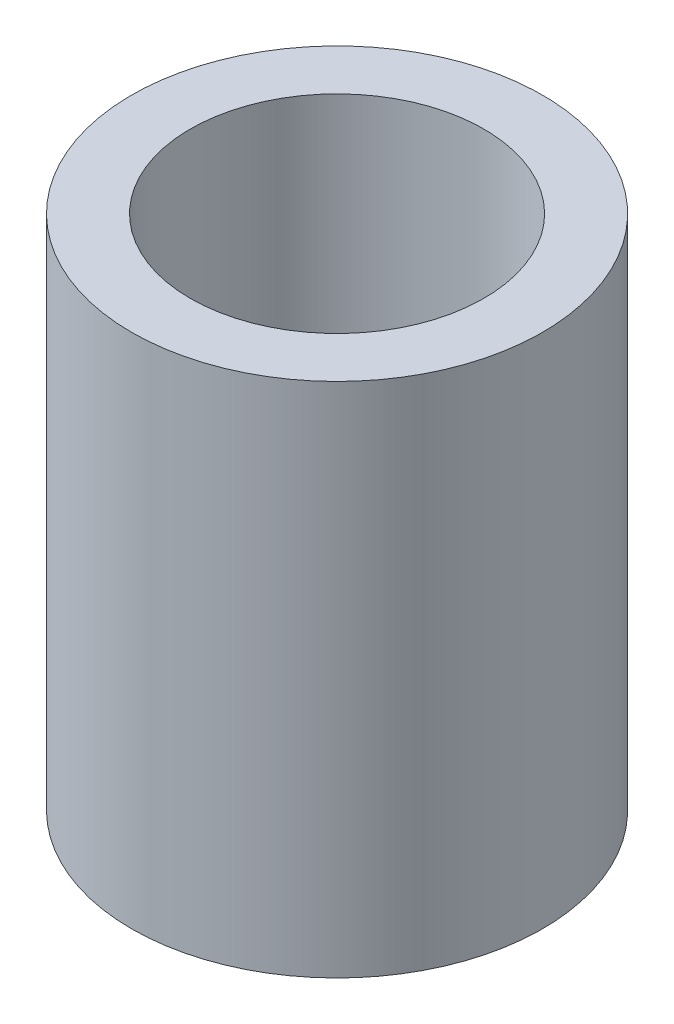
ISO-10303-21;
HEADER;
FILE_DESCRIPTION(('STEP AP214'),'2;1');
FILE_NAME('part.step','',(''),(''),'','','');
FILE_SCHEMA(('AUTOMOTIVE_DESIGN { 1 0 10303 214 1 1 1 1 }'));
ENDSEC;
DATA;
#1=APPLICATION_CONTEXT('core data for automotive mechanical design processes');
#2=APPLICATION_PROTOCOL_DEFINITION('international standard','automotive_design',2000,#1);
#3=PRODUCT_CONTEXT('',#1,'mechanical');
#4=PRODUCT('Part','Part','',(#3));
#5=PRODUCT_RELATED_PRODUCT_CATEGORY('part','',(#4));
#6=PRODUCT_DEFINITION_FORMATION('','',#4);
#7=PRODUCT_DEFINITION_CONTEXT('part definition',#1,'design');
#8=PRODUCT_DEFINITION('design','',#6,#7);
#9=PRODUCT_DEFINITION_SHAPE('','',#8);
#10=(LENGTH_UNIT() NAMED_UNIT(*) SI_UNIT(.MILLI.,.METRE.));
#11=(NAMED_UNIT(*) PLANE_ANGLE_UNIT() SI_UNIT($,.RADIAN.));
#12=(NAMED_UNIT(*) SI_UNIT($,.STERADIAN.) SOLID_ANGLE_UNIT());
#13=UNCERTAINTY_MEASURE_WITH_UNIT(LENGTH_MEASURE(1.E-05),#10,'distance_accuracy_value','');
#14=(GEOMETRIC_REPRESENTATION_CONTEXT(3) GLOBAL_UNCERTAINTY_ASSIGNED_CONTEXT((#13)) GLOBAL_UNIT_ASSIGNED_CONTEXT((#10,
#11,#12)) REPRESENTATION_CONTEXT('',''));
#15=CARTESIAN_POINT('',(0.,0.,0.));
#16=DIRECTION('',(0.,0.,1.));
#17=DIRECTION('',(1.,0.,0.));
#18=AXIS2_PLACEMENT_3D('',#15,#16,#17);
#19=CARTESIAN_POINT('',(0.,-13.97,0.));
#20=DIRECTION('',(0.,1.,0.));
#21=DIRECTION('',(0.,0.,1.));
#22=AXIS2_PLACEMENT_3D('',#19,#20,#21);
#23=CYLINDRICAL_SURFACE('',#22,5.55625);
#24=CARTESIAN_POINT('',(0.,-13.97,0.));
#25=DIRECTION('',(0.,1.,0.));
#26=DIRECTION('',(0.,0.,1.));
#27=AXIS2_PLACEMENT_3D('',#24,#25,#26);
#28=CIRCLE('',#27,5.55625);
#29=CARTESIAN_POINT('',(0.,-13.97,5.55625));
#30=VERTEX_POINT('',#29);
#31=EDGE_CURVE('E10',#30,#30,#28,.T.);
#32=ORIENTED_EDGE('',*,*,#31,.T.);
#33=EDGE_LOOP('',(#32));
#34=FACE_BOUND('',#33,.T.);
#35=CARTESIAN_POINT('',(0.,0.,0.));
#36=DIRECTION('',(0.,1.,0.));
#37=DIRECTION('',(0.,0.,1.));
#38=AXIS2_PLACEMENT_3D('',#35,#36,#37);
#39=CIRCLE('',#38,5.55625);
#40=CARTESIAN_POINT('',(0.,0.,5.55625));
#41=VERTEX_POINT('',#40);
#42=EDGE_CURVE('E42',#41,#41,#39,.T.);
#43=ORIENTED_EDGE('',*,*,#42,.F.);
#44=EDGE_LOOP('',(#43));
#45=FACE_BOUND('',#44,.T.);
#46=ADVANCED_FACE('F39',(#34,#45),#23,.T.);
#47=CARTESIAN_POINT('',(0.,-13.97,0.));
#48=DIRECTION('',(0.,1.,0.));
#49=DIRECTION('',(0.,0.,1.));
#50=AXIS2_PLACEMENT_3D('',#47,#48,#49);
#51=PLANE('',#50);
#52=CARTESIAN_POINT('',(0.,-13.97,0.));
#53=DIRECTION('',(0.,1.,0.));
#54=DIRECTION('',(0.,0.,1.));
#55=AXIS2_PLACEMENT_3D('',#52,#53,#54);
#56=CIRCLE('',#55,3.96875);
#57=CARTESIAN_POINT('',(0.,-13.97,3.96875));
#58=VERTEX_POINT('',#57);
#59=EDGE_CURVE('E49',#58,#58,#56,.T.);
#60=ORIENTED_EDGE('',*,*,#59,.T.);
#61=EDGE_LOOP('',(#60));
#62=FACE_BOUND('',#61,.T.);
#63=ORIENTED_EDGE('',*,*,#31,.F.);
#64=EDGE_LOOP('',(#63));
#65=FACE_BOUND('',#64,.T.);
#66=ADVANCED_FACE('F57',(#62,#65),#51,.F.);
#67=CARTESIAN_POINT('',(0.,0.,0.));
#68=DIRECTION('',(0.,1.,0.));
#69=DIRECTION('',(0.,0.,1.));
#70=AXIS2_PLACEMENT_3D('',#67,#68,#69);
#71=PLANE('',#70);
#72=CARTESIAN_POINT('',(0.,0.,0.));
#73=DIRECTION('',(0.,1.,0.));
#74=DIRECTION('',(0.,0.,1.));
#75=AXIS2_PLACEMENT_3D('',#72,#73,#74);
#76=CIRCLE('',#75,3.96875);
#77=CARTESIAN_POINT('',(0.,0.,3.96875));
#78=VERTEX_POINT('',#77);
#79=EDGE_CURVE('E51',#78,#78,#76,.T.);
#80=ORIENTED_EDGE('',*,*,#79,.F.);
#81=EDGE_LOOP('',(#80));
#82=FACE_BOUND('',#81,.T.);
#83=ORIENTED_EDGE('',*,*,#42,.T.);
#84=EDGE_LOOP('',(#83));
#85=FACE_BOUND('',#84,.T.);
#86=ADVANCED_FACE('F63',(#82,#85),#71,.T.);
#87=CARTESIAN_POINT('',(0.,-13.97,0.));
#88=DIRECTION('',(0.,1.,0.));
#89=DIRECTION('',(0.,0.,1.));
#90=AXIS2_PLACEMENT_3D('',#87,#88,#89);
#91=CYLINDRICAL_SURFACE('',#90,3.96875);
#92=ORIENTED_EDGE('',*,*,#59,.F.);
#93=EDGE_LOOP('',(#92));
#94=FACE_BOUND('',#93,.T.);
#95=ORIENTED_EDGE('',*,*,#79,.T.);
#96=EDGE_LOOP('',(#95));
#97=FACE_BOUND('',#96,.T.);
#98=ADVANCED_FACE('F60',(#94,#97),#91,.F.);
#99=CLOSED_SHELL('',(#46,#66,#86,#98));
#100=MANIFOLD_SOLID_BREP('B2',#99);
#101=ADVANCED_BREP_SHAPE_REPRESENTATION('',(#18,#100),#14);
#102=SHAPE_DEFINITION_REPRESENTATION(#9,#101);
ENDSEC;
END-ISO-10303-21;
